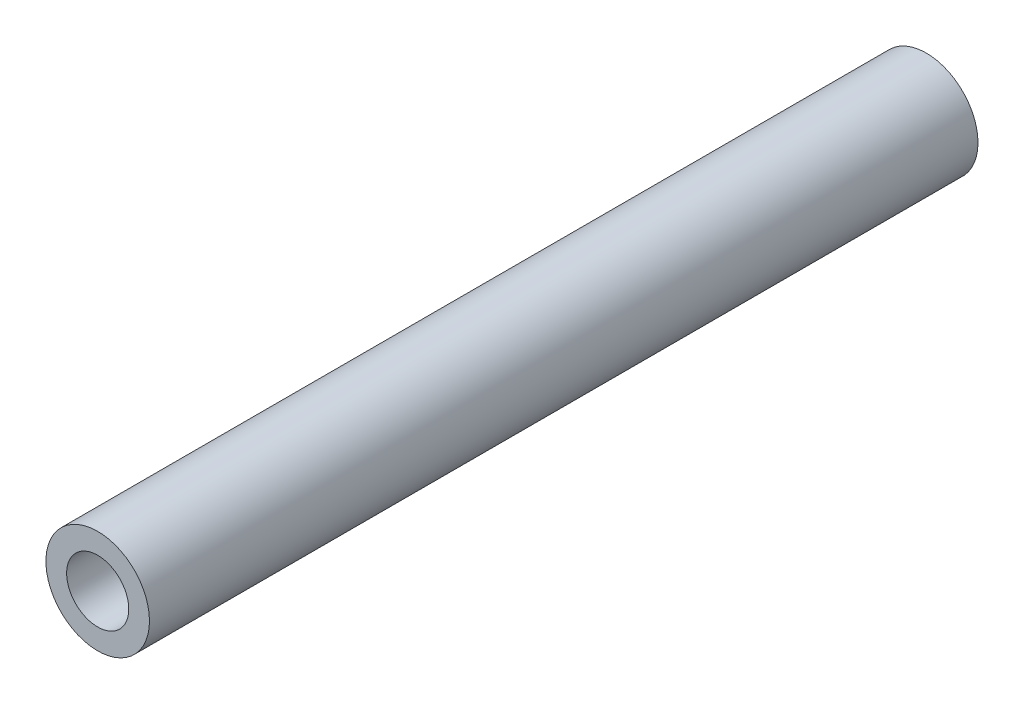
ISO-10303-21;
HEADER;
FILE_DESCRIPTION(('STEP AP214'),'2;1');
FILE_NAME('part.step','',(''),(''),'','','');
FILE_SCHEMA(('AUTOMOTIVE_DESIGN { 1 0 10303 214 1 1 1 1 }'));
ENDSEC;
DATA;
#1=APPLICATION_CONTEXT('core data for automotive mechanical design processes');
#2=APPLICATION_PROTOCOL_DEFINITION('international standard','automotive_design',2000,#1);
#3=PRODUCT_CONTEXT('',#1,'mechanical');
#4=PRODUCT('Part','Part','',(#3));
#5=PRODUCT_RELATED_PRODUCT_CATEGORY('part','',(#4));
#6=PRODUCT_DEFINITION_FORMATION('','',#4);
#7=PRODUCT_DEFINITION_CONTEXT('part definition',#1,'design');
#8=PRODUCT_DEFINITION('design','',#6,#7);
#9=PRODUCT_DEFINITION_SHAPE('','',#8);
#10=(LENGTH_UNIT() NAMED_UNIT(*) SI_UNIT(.MILLI.,.METRE.));
#11=(NAMED_UNIT(*) PLANE_ANGLE_UNIT() SI_UNIT($,.RADIAN.));
#12=(NAMED_UNIT(*) SI_UNIT($,.STERADIAN.) SOLID_ANGLE_UNIT());
#13=UNCERTAINTY_MEASURE_WITH_UNIT(LENGTH_MEASURE(1.E-05),#10,'distance_accuracy_value','');
#14=(GEOMETRIC_REPRESENTATION_CONTEXT(3) GLOBAL_UNCERTAINTY_ASSIGNED_CONTEXT((#13)) GLOBAL_UNIT_ASSIGNED_CONTEXT((#10,
#11,#12)) REPRESENTATION_CONTEXT('',''));
#15=CARTESIAN_POINT('',(0.,0.,0.));
#16=DIRECTION('',(0.,0.,1.));
#17=DIRECTION('',(1.,0.,0.));
#18=AXIS2_PLACEMENT_3D('',#15,#16,#17);
#19=CARTESIAN_POINT('',(0.,0.,40.));
#20=DIRECTION('',(0.,0.,1.));
#21=DIRECTION('',(1.,0.,0.));
#22=AXIS2_PLACEMENT_3D('',#19,#20,#21);
#23=PLANE('',#22);
#24=CARTESIAN_POINT('',(0.,0.,40.));
#25=DIRECTION('',(0.,0.,1.));
#26=DIRECTION('',(1.,0.,0.));
#27=AXIS2_PLACEMENT_3D('',#24,#25,#26);
#28=CIRCLE('',#27,2.5);
#29=CARTESIAN_POINT('',(2.5,0.,40.));
#30=VERTEX_POINT('',#29);
#31=EDGE_CURVE('E10',#30,#30,#28,.T.);
#32=ORIENTED_EDGE('',*,*,#31,.T.);
#33=EDGE_LOOP('',(#32));
#34=FACE_BOUND('',#33,.T.);
#35=CARTESIAN_POINT('',(0.,0.,40.));
#36=DIRECTION('',(0.,0.,1.));
#37=DIRECTION('',(1.,0.,0.));
#38=AXIS2_PLACEMENT_3D('',#35,#36,#37);
#39=CIRCLE('',#38,1.5);
#40=CARTESIAN_POINT('',(1.5,0.,40.));
#41=VERTEX_POINT('',#40);
#42=EDGE_CURVE('E50',#41,#41,#39,.T.);
#43=ORIENTED_EDGE('',*,*,#42,.F.);
#44=EDGE_LOOP('',(#43));
#45=FACE_BOUND('',#44,.T.);
#46=ADVANCED_FACE('F37',(#34,#45),#23,.T.);
#47=CARTESIAN_POINT('',(0.,0.,0.));
#48=DIRECTION('',(0.,0.,1.));
#49=DIRECTION('',(1.,0.,0.));
#50=AXIS2_PLACEMENT_3D('',#47,#48,#49);
#51=PLANE('',#50);
#52=CARTESIAN_POINT('',(0.,0.,0.));
#53=DIRECTION('',(0.,0.,1.));
#54=DIRECTION('',(1.,0.,0.));
#55=AXIS2_PLACEMENT_3D('',#52,#53,#54);
#56=CIRCLE('',#55,2.5);
#57=CARTESIAN_POINT('',(2.5,0.,0.));
#58=VERTEX_POINT('',#57);
#59=EDGE_CURVE('E41',#58,#58,#56,.T.);
#60=ORIENTED_EDGE('',*,*,#59,.F.);
#61=EDGE_LOOP('',(#60));
#62=FACE_BOUND('',#61,.T.);
#63=CARTESIAN_POINT('',(0.,0.,0.));
#64=DIRECTION('',(0.,0.,1.));
#65=DIRECTION('',(1.,0.,0.));
#66=AXIS2_PLACEMENT_3D('',#63,#64,#65);
#67=CIRCLE('',#66,1.5);
#68=CARTESIAN_POINT('',(1.5,0.,0.));
#69=VERTEX_POINT('',#68);
#70=EDGE_CURVE('E52',#69,#69,#67,.T.);
#71=ORIENTED_EDGE('',*,*,#70,.T.);
#72=EDGE_LOOP('',(#71));
#73=FACE_BOUND('',#72,.T.);
#74=ADVANCED_FACE('F64',(#62,#73),#51,.F.);
#75=CARTESIAN_POINT('',(0.,0.,40.));
#76=DIRECTION('',(0.,0.,-1.));
#77=DIRECTION('',(-1.,0.,0.));
#78=AXIS2_PLACEMENT_3D('',#75,#76,#77);
#79=CYLINDRICAL_SURFACE('',#78,2.5);
#80=ORIENTED_EDGE('',*,*,#31,.F.);
#81=EDGE_LOOP('',(#80));
#82=FACE_BOUND('',#81,.T.);
#83=ORIENTED_EDGE('',*,*,#59,.T.);
#84=EDGE_LOOP('',(#83));
#85=FACE_BOUND('',#84,.T.);
#86=ADVANCED_FACE('F39',(#82,#85),#79,.T.);
#87=CARTESIAN_POINT('',(0.,0.,40.));
#88=DIRECTION('',(0.,0.,-1.));
#89=DIRECTION('',(-1.,0.,0.));
#90=AXIS2_PLACEMENT_3D('',#87,#88,#89);
#91=CYLINDRICAL_SURFACE('',#90,1.5);
#92=ORIENTED_EDGE('',*,*,#42,.T.);
#93=EDGE_LOOP('',(#92));
#94=FACE_BOUND('',#93,.T.);
#95=ORIENTED_EDGE('',*,*,#70,.F.);
#96=EDGE_LOOP('',(#95));
#97=FACE_BOUND('',#96,.T.);
#98=ADVANCED_FACE('F60',(#94,#97),#91,.F.);
#99=CLOSED_SHELL('',(#46,#74,#86,#98));
#100=MANIFOLD_SOLID_BREP('B2',#99);
#101=ADVANCED_BREP_SHAPE_REPRESENTATION('',(#18,#100),#14);
#102=SHAPE_DEFINITION_REPRESENTATION(#9,#101);
ENDSEC;
END-ISO-10303-21;
